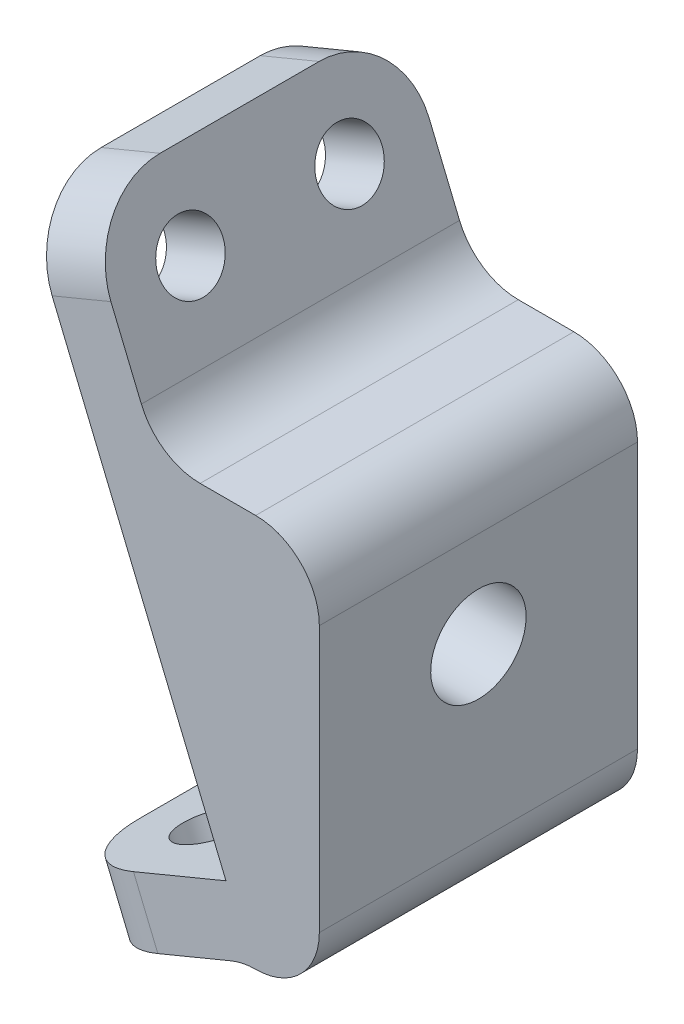
ISO-10303-21;
HEADER;
FILE_DESCRIPTION(('STEP AP214'),'2;1');
FILE_NAME('part.step','',(''),(''),'','','');
FILE_SCHEMA(('AUTOMOTIVE_DESIGN { 1 0 10303 214 1 1 1 1 }'));
ENDSEC;
DATA;
#1=APPLICATION_CONTEXT('core data for automotive mechanical design processes');
#2=APPLICATION_PROTOCOL_DEFINITION('international standard','automotive_design',2000,#1);
#3=PRODUCT_CONTEXT('',#1,'mechanical');
#4=PRODUCT('Part','Part','',(#3));
#5=PRODUCT_RELATED_PRODUCT_CATEGORY('part','',(#4));
#6=PRODUCT_DEFINITION_FORMATION('','',#4);
#7=PRODUCT_DEFINITION_CONTEXT('part definition',#1,'design');
#8=PRODUCT_DEFINITION('design','',#6,#7);
#9=PRODUCT_DEFINITION_SHAPE('','',#8);
#10=(LENGTH_UNIT() NAMED_UNIT(*) SI_UNIT(.MILLI.,.METRE.));
#11=(NAMED_UNIT(*) PLANE_ANGLE_UNIT() SI_UNIT($,.RADIAN.));
#12=(NAMED_UNIT(*) SI_UNIT($,.STERADIAN.) SOLID_ANGLE_UNIT());
#13=UNCERTAINTY_MEASURE_WITH_UNIT(LENGTH_MEASURE(1.E-05),#10,'distance_accuracy_value','');
#14=(GEOMETRIC_REPRESENTATION_CONTEXT(3) GLOBAL_UNCERTAINTY_ASSIGNED_CONTEXT((#13)) GLOBAL_UNIT_ASSIGNED_CONTEXT((#10,
#11,#12)) REPRESENTATION_CONTEXT('',''));
#15=CARTESIAN_POINT('',(0.,0.,0.));
#16=DIRECTION('',(0.,0.,1.));
#17=DIRECTION('',(1.,0.,0.));
#18=AXIS2_PLACEMENT_3D('',#15,#16,#17);
#19=CARTESIAN_POINT('',(24.9233328303467,-24.0423698814154,15.875));
#20=DIRECTION('',(0.923879532511289,0.382683432365084,0.));
#21=DIRECTION('',(-0.382683432365084,0.923879532511289,0.));
#22=AXIS2_PLACEMENT_3D('',#19,#20,#21);
#23=PLANE('',#22);
#24=DIRECTION('',(0.382683432365084,-0.923879532511289,0.));
#25=VECTOR('',#24,1.);
#26=CARTESIAN_POINT('',(3.67887721410562,27.2462829925481,-7.9375));
#27=LINE('',#26,#25);
#28=CARTESIAN_POINT('',(24.9233328303467,-24.0423698814154,-7.9375));
#29=VERTEX_POINT('',#28);
#30=CARTESIAN_POINT('',(27.353372625865,-29.909004912862,-7.9375));
#31=VERTEX_POINT('',#30);
#32=EDGE_CURVE('E456',#29,#31,#27,.T.);
#33=ORIENTED_EDGE('',*,*,#32,.T.);
#34=DIRECTION('',(0.,0.,-1.));
#35=VECTOR('',#34,1.);
#36=CARTESIAN_POINT('',(27.353372625865,-29.909004912862,15.875));
#37=LINE('',#36,#35);
#38=CARTESIAN_POINT('',(27.353372625865,-29.909004912862,7.9375));
#39=VERTEX_POINT('',#38);
#40=EDGE_CURVE('E281',#39,#31,#37,.T.);
#41=ORIENTED_EDGE('',*,*,#40,.F.);
#42=DIRECTION('',(0.382683432365084,-0.923879532511289,0.));
#43=VECTOR('',#42,1.);
#44=CARTESIAN_POINT('',(3.67887721410562,27.2462829925481,7.9375));
#45=LINE('',#44,#43);
#46=CARTESIAN_POINT('',(24.9233328303467,-24.0423698814154,7.9375));
#47=VERTEX_POINT('',#46);
#48=EDGE_CURVE('E57',#47,#39,#45,.T.);
#49=ORIENTED_EDGE('',*,*,#48,.F.);
#50=DIRECTION('',(0.,0.,-1.));
#51=VECTOR('',#50,1.);
#52=CARTESIAN_POINT('',(24.9233328303467,-24.0423698814154,15.875));
#53=LINE('',#52,#51);
#54=EDGE_CURVE('E169',#47,#29,#53,.T.);
#55=ORIENTED_EDGE('',*,*,#54,.T.);
#56=EDGE_LOOP('',(#33,#41,#49,#55));
#57=FACE_BOUND('',#56,.T.);
#58=ADVANCED_FACE('F39',(#57),#23,.F.);
#59=CARTESIAN_POINT('',(21.0980673275658,32.0315079875802,15.875));
#60=DIRECTION('',(0.382683432365084,-0.923879532511289,0.));
#61=DIRECTION('',(0.923879532511289,0.382683432365084,0.));
#62=AXIS2_PLACEMENT_3D('',#59,#60,#61);
#63=PLANE('',#62);
#64=DIRECTION('',(0.,0.,-1.));
#65=VECTOR('',#64,1.);
#66=CARTESIAN_POINT('',(26.9647023590125,34.4615477830985,15.875));
#67=LINE('',#66,#65);
#68=CARTESIAN_POINT('',(26.9647023590125,34.4615477830985,7.9375));
#69=VERTEX_POINT('',#68);
#70=CARTESIAN_POINT('',(26.9647023590125,34.4615477830985,-7.9375));
#71=VERTEX_POINT('',#70);
#72=EDGE_CURVE('E249',#69,#71,#67,.T.);
#73=ORIENTED_EDGE('',*,*,#72,.T.);
#74=DIRECTION('',(0.923879532511289,0.382683432365085,0.));
#75=VECTOR('',#74,1.);
#76=CARTESIAN_POINT('',(-0.801211023471759,22.9605298883971,-7.9375));
#77=LINE('',#76,#75);
#78=CARTESIAN_POINT('',(21.0980673275658,32.0315079875802,-7.9375));
#79=VERTEX_POINT('',#78);
#80=EDGE_CURVE('E318',#79,#71,#77,.T.);
#81=ORIENTED_EDGE('',*,*,#80,.F.);
#82=DIRECTION('',(0.,0.,-1.));
#83=VECTOR('',#82,1.);
#84=CARTESIAN_POINT('',(21.0980673275658,32.0315079875802,15.875));
#85=LINE('',#84,#83);
#86=CARTESIAN_POINT('',(21.0980673275658,32.0315079875802,7.9375));
#87=VERTEX_POINT('',#86);
#88=EDGE_CURVE('E245',#87,#79,#85,.T.);
#89=ORIENTED_EDGE('',*,*,#88,.F.);
#90=DIRECTION('',(0.923879532511289,0.382683432365085,0.));
#91=VECTOR('',#90,1.);
#92=CARTESIAN_POINT('',(-0.801211023471759,22.9605298883971,7.9375));
#93=LINE('',#92,#91);
#94=EDGE_CURVE('E327',#87,#69,#93,.T.);
#95=ORIENTED_EDGE('',*,*,#94,.T.);
#96=EDGE_LOOP('',(#73,#81,#89,#95));
#97=FACE_BOUND('',#96,.T.);
#98=ADVANCED_FACE('F370',(#97),#63,.F.);
#99=CARTESIAN_POINT('',(44.45,-29.700540455513,15.875));
#100=DIRECTION('',(0.,0.,1.));
#101=DIRECTION('',(1.,0.,0.));
#102=AXIS2_PLACEMENT_3D('',#99,#100,#101);
#103=PLANE('',#102);
#104=DIRECTION('',(0.382683432365084,-0.923879532511289,0.));
#105=VECTOR('',#104,1.);
#106=CARTESIAN_POINT('',(11.012171003414,30.2838327369459,15.875));
#107=LINE('',#106,#105);
#108=CARTESIAN_POINT('',(32.2566266196551,-21.0048201370175,15.875));
#109=VERTEX_POINT('',#108);
#110=CARTESIAN_POINT('',(34.6866664151734,-26.8714551684642,15.875));
#111=VERTEX_POINT('',#110);
#112=EDGE_CURVE('E152',#109,#111,#107,.T.);
#113=ORIENTED_EDGE('',*,*,#112,.T.);
#114=DIRECTION('',(0.923879532511289,0.382683432365084,0.));
#115=VECTOR('',#114,1.);
#116=CARTESIAN_POINT('',(27.353372625865,-29.909004912862,15.875));
#117=LINE('',#116,#115);
#118=CARTESIAN_POINT('',(42.0199602044817,-23.8339054240663,15.875));
#119=VERTEX_POINT('',#118);
#120=EDGE_CURVE('E179',#111,#119,#117,.T.);
#121=ORIENTED_EDGE('',*,*,#120,.T.);
#122=CARTESIAN_POINT('',(44.45,-29.700540455513,15.875));
#123=DIRECTION('',(0.,0.,-1.));
#124=DIRECTION('',(1.,0.,0.));
#125=AXIS2_PLACEMENT_3D('',#122,#123,#124);
#126=CIRCLE('',#125,6.35);
#127=CARTESIAN_POINT('',(44.45,-23.350540455513,15.875));
#128=VERTEX_POINT('',#127);
#129=EDGE_CURVE('E184',#119,#128,#126,.T.);
#130=ORIENTED_EDGE('',*,*,#129,.T.);
#131=CARTESIAN_POINT('',(44.45,-17.000540455513,15.875));
#132=DIRECTION('',(0.,0.,1.));
#133=DIRECTION('',(-1.,0.,0.));
#134=AXIS2_PLACEMENT_3D('',#131,#132,#133);
#135=CIRCLE('',#134,6.35);
#136=CARTESIAN_POINT('',(50.8,-17.000540455513,15.875));
#137=VERTEX_POINT('',#136);
#138=EDGE_CURVE('E194',#128,#137,#135,.T.);
#139=ORIENTED_EDGE('',*,*,#138,.T.);
#140=DIRECTION('',(0.,1.,0.));
#141=VECTOR('',#140,1.);
#142=CARTESIAN_POINT('',(50.8,9.52500000000001,15.875));
#143=LINE('',#142,#141);
#144=CARTESIAN_POINT('',(50.8,9.52500000000001,15.875));
#145=VERTEX_POINT('',#144);
#146=EDGE_CURVE('E197',#137,#145,#143,.T.);
#147=ORIENTED_EDGE('',*,*,#146,.T.);
#148=CARTESIAN_POINT('',(44.45,9.52500000000001,15.875));
#149=DIRECTION('',(0.,0.,1.));
#150=DIRECTION('',(1.,0.,0.));
#151=AXIS2_PLACEMENT_3D('',#148,#149,#150);
#152=CIRCLE('',#151,6.35);
#153=CARTESIAN_POINT('',(44.45,15.875,15.875));
#154=VERTEX_POINT('',#153);
#155=EDGE_CURVE('E200',#145,#154,#152,.T.);
#156=ORIENTED_EDGE('',*,*,#155,.T.);
#157=DIRECTION('',(-1.,0.,0.));
#158=VECTOR('',#157,1.);
#159=CARTESIAN_POINT('',(44.45,15.875,15.875));
#160=LINE('',#159,#158);
#161=CARTESIAN_POINT('',(38.9064368792549,15.875,15.875));
#162=VERTEX_POINT('',#161);
#163=EDGE_CURVE('E203',#154,#162,#160,.T.);
#164=ORIENTED_EDGE('',*,*,#163,.T.);
#165=CARTESIAN_POINT('',(38.9064368792549,22.2250000000001,15.875));
#166=DIRECTION('',(0.,0.,-1.));
#167=DIRECTION('',(-1.,0.,0.));
#168=AXIS2_PLACEMENT_3D('',#165,#166,#167);
#169=CIRCLE('',#168,6.35000000000003);
#170=CARTESIAN_POINT('',(33.0398018478082,19.7949602044818,15.875));
#171=VERTEX_POINT('',#170);
#172=EDGE_CURVE('E206',#162,#171,#169,.T.);
#173=ORIENTED_EDGE('',*,*,#172,.T.);
#174=DIRECTION('',(-0.382683432365085,0.923879532511289,0.));
#175=VECTOR('',#174,1.);
#176=CARTESIAN_POINT('',(26.9647023590125,34.4615477830985,15.875));
#177=LINE('',#176,#175);
#178=CARTESIAN_POINT('',(30.0022521034103,27.1282539937901,15.875));
#179=VERTEX_POINT('',#178);
#180=EDGE_CURVE('E209',#171,#179,#177,.T.);
#181=ORIENTED_EDGE('',*,*,#180,.T.);
#182=DIRECTION('',(0.923879532511289,0.382683432365085,0.));
#183=VECTOR('',#182,1.);
#184=CARTESIAN_POINT('',(2.2363387209261,15.6272360990887,15.875));
#185=LINE('',#184,#183);
#186=CARTESIAN_POINT('',(24.1356170719637,24.6982141982718,15.875));
#187=VERTEX_POINT('',#186);
#188=EDGE_CURVE('E290',#179,#187,#185,.F.);
#189=ORIENTED_EDGE('',*,*,#188,.T.);
#190=DIRECTION('',(0.382683432365084,-0.923879532511289,0.));
#191=VECTOR('',#190,1.);
#192=CARTESIAN_POINT('',(21.0980673275658,32.0315079875802,15.875));
#193=LINE('',#192,#191);
#194=CARTESIAN_POINT('',(41.4833741348249,-17.182976179642,15.875));
#195=VERTEX_POINT('',#194);
#196=EDGE_CURVE('E176',#187,#195,#193,.T.);
#197=ORIENTED_EDGE('',*,*,#196,.T.);
#198=DIRECTION('',(-0.923879532511289,-0.382683432365084,0.));
#199=VECTOR('',#198,1.);
#200=CARTESIAN_POINT('',(41.4833741348249,-17.182976179642,15.875));
#201=LINE('',#200,#199);
#202=EDGE_CURVE('E166',#195,#109,#201,.T.);
#203=ORIENTED_EDGE('',*,*,#202,.T.);
#204=EDGE_LOOP('',(#113,#121,#130,#139,#147,#156,#164,#173,#181,#189,#197,#203));
#205=FACE_BOUND('',#204,.T.);
#206=ADVANCED_FACE('F173',(#205),#103,.T.);
#207=CARTESIAN_POINT('',(44.45,-29.700540455513,-15.875));
#208=DIRECTION('',(0.,0.,1.));
#209=DIRECTION('',(1.,0.,0.));
#210=AXIS2_PLACEMENT_3D('',#207,#208,#209);
#211=PLANE('',#210);
#212=DIRECTION('',(0.923879532511289,0.382683432365084,0.));
#213=VECTOR('',#212,1.);
#214=CARTESIAN_POINT('',(27.353372625865,-29.909004912862,-15.875));
#215=LINE('',#214,#213);
#216=CARTESIAN_POINT('',(34.6866664151734,-26.8714551684642,-15.875));
#217=VERTEX_POINT('',#216);
#218=CARTESIAN_POINT('',(42.0199602044817,-23.8339054240663,-15.875));
#219=VERTEX_POINT('',#218);
#220=EDGE_CURVE('E219',#217,#219,#215,.T.);
#221=ORIENTED_EDGE('',*,*,#220,.F.);
#222=DIRECTION('',(0.382683432365084,-0.923879532511289,0.));
#223=VECTOR('',#222,1.);
#224=CARTESIAN_POINT('',(11.012171003414,30.283832736946,-15.875));
#225=LINE('',#224,#223);
#226=CARTESIAN_POINT('',(32.2566266196551,-21.0048201370175,-15.875));
#227=VERTEX_POINT('',#226);
#228=EDGE_CURVE('E65',#227,#217,#225,.T.);
#229=ORIENTED_EDGE('',*,*,#228,.F.);
#230=DIRECTION('',(-0.923879532511289,-0.382683432365084,0.));
#231=VECTOR('',#230,1.);
#232=CARTESIAN_POINT('',(41.4833741348249,-17.182976179642,-15.875));
#233=LINE('',#232,#231);
#234=CARTESIAN_POINT('',(41.4833741348249,-17.182976179642,-15.875));
#235=VERTEX_POINT('',#234);
#236=EDGE_CURVE('E216',#235,#227,#233,.T.);
#237=ORIENTED_EDGE('',*,*,#236,.F.);
#238=DIRECTION('',(0.382683432365084,-0.923879532511289,0.));
#239=VECTOR('',#238,1.);
#240=CARTESIAN_POINT('',(21.0980673275658,32.0315079875802,-15.875));
#241=LINE('',#240,#239);
#242=CARTESIAN_POINT('',(24.1356170719637,24.6982141982718,-15.875));
#243=VERTEX_POINT('',#242);
#244=EDGE_CURVE('E180',#243,#235,#241,.T.);
#245=ORIENTED_EDGE('',*,*,#244,.F.);
#246=DIRECTION('',(0.923879532511289,0.382683432365085,0.));
#247=VECTOR('',#246,1.);
#248=CARTESIAN_POINT('',(2.2363387209261,15.6272360990887,-15.875));
#249=LINE('',#248,#247);
#250=CARTESIAN_POINT('',(30.0022521034103,27.1282539937901,-15.875));
#251=VERTEX_POINT('',#250);
#252=EDGE_CURVE('E287',#251,#243,#249,.F.);
#253=ORIENTED_EDGE('',*,*,#252,.F.);
#254=DIRECTION('',(-0.382683432365085,0.923879532511289,0.));
#255=VECTOR('',#254,1.);
#256=CARTESIAN_POINT('',(26.9647023590125,34.4615477830985,-15.875));
#257=LINE('',#256,#255);
#258=CARTESIAN_POINT('',(33.0398018478082,19.7949602044818,-15.875));
#259=VERTEX_POINT('',#258);
#260=EDGE_CURVE('E186',#259,#251,#257,.T.);
#261=ORIENTED_EDGE('',*,*,#260,.F.);
#262=CARTESIAN_POINT('',(38.9064368792549,22.2250000000001,-15.875));
#263=DIRECTION('',(0.,0.,-1.));
#264=DIRECTION('',(-1.,0.,0.));
#265=AXIS2_PLACEMENT_3D('',#262,#263,#264);
#266=CIRCLE('',#265,6.35000000000003);
#267=CARTESIAN_POINT('',(38.9064368792549,15.875,-15.875));
#268=VERTEX_POINT('',#267);
#269=EDGE_CURVE('E237',#268,#259,#266,.T.);
#270=ORIENTED_EDGE('',*,*,#269,.F.);
#271=DIRECTION('',(-1.,0.,0.));
#272=VECTOR('',#271,1.);
#273=CARTESIAN_POINT('',(44.45,15.875,-15.875));
#274=LINE('',#273,#272);
#275=CARTESIAN_POINT('',(44.45,15.875,-15.875));
#276=VERTEX_POINT('',#275);
#277=EDGE_CURVE('E234',#276,#268,#274,.T.);
#278=ORIENTED_EDGE('',*,*,#277,.F.);
#279=CARTESIAN_POINT('',(44.45,9.52500000000001,-15.875));
#280=DIRECTION('',(0.,0.,1.));
#281=DIRECTION('',(1.,0.,0.));
#282=AXIS2_PLACEMENT_3D('',#279,#280,#281);
#283=CIRCLE('',#282,6.35);
#284=CARTESIAN_POINT('',(50.8,9.52500000000001,-15.875));
#285=VERTEX_POINT('',#284);
#286=EDGE_CURVE('E231',#285,#276,#283,.T.);
#287=ORIENTED_EDGE('',*,*,#286,.F.);
#288=DIRECTION('',(0.,1.,0.));
#289=VECTOR('',#288,1.);
#290=CARTESIAN_POINT('',(50.8,9.52500000000001,-15.875));
#291=LINE('',#290,#289);
#292=CARTESIAN_POINT('',(50.8,-17.000540455513,-15.875));
#293=VERTEX_POINT('',#292);
#294=EDGE_CURVE('E228',#293,#285,#291,.T.);
#295=ORIENTED_EDGE('',*,*,#294,.F.);
#296=CARTESIAN_POINT('',(44.45,-17.000540455513,-15.875));
#297=DIRECTION('',(0.,0.,1.));
#298=DIRECTION('',(-1.,0.,0.));
#299=AXIS2_PLACEMENT_3D('',#296,#297,#298);
#300=CIRCLE('',#299,6.35);
#301=CARTESIAN_POINT('',(44.45,-23.350540455513,-15.875));
#302=VERTEX_POINT('',#301);
#303=EDGE_CURVE('E225',#302,#293,#300,.T.);
#304=ORIENTED_EDGE('',*,*,#303,.F.);
#305=CARTESIAN_POINT('',(44.45,-29.700540455513,-15.875));
#306=DIRECTION('',(0.,0.,-1.));
#307=DIRECTION('',(1.,0.,0.));
#308=AXIS2_PLACEMENT_3D('',#305,#306,#307);
#309=CIRCLE('',#308,6.35);
#310=EDGE_CURVE('E222',#219,#302,#309,.T.);
#311=ORIENTED_EDGE('',*,*,#310,.F.);
#312=EDGE_LOOP('',(#221,#229,#237,#245,#253,#261,#270,#278,#287,#295,#304,#311));
#313=FACE_BOUND('',#312,.T.);
#314=ADVANCED_FACE('F413',(#313),#211,.F.);
#315=CARTESIAN_POINT('',(41.4833741348249,-17.182976179642,15.875));
#316=DIRECTION('',(0.382683432365084,-0.923879532511289,0.));
#317=DIRECTION('',(0.923879532511289,0.382683432365084,0.));
#318=AXIS2_PLACEMENT_3D('',#315,#316,#317);
#319=PLANE('',#318);
#320=CARTESIAN_POINT('',(32.2566266196551,-21.0048201370175,7.9375));
#321=DIRECTION('',(0.382683432365084,-0.923879532511289,0.));
#322=DIRECTION('',(0.923879532511289,0.382683432365084,0.));
#323=AXIS2_PLACEMENT_3D('',#320,#321,#322);
#324=CIRCLE('',#323,3.2385);
#325=CARTESIAN_POINT('',(35.2486104856929,-19.7654998413032,7.9375));
#326=VERTEX_POINT('',#325);
#327=EDGE_CURVE('E311',#326,#326,#324,.T.);
#328=ORIENTED_EDGE('',*,*,#327,.T.);
#329=EDGE_LOOP('',(#328));
#330=FACE_BOUND('',#329,.T.);
#331=CARTESIAN_POINT('',(32.2566266196551,-21.0048201370175,-7.9375));
#332=DIRECTION('',(0.382683432365084,-0.923879532511289,0.));
#333=DIRECTION('',(0.923879532511289,0.382683432365084,0.));
#334=AXIS2_PLACEMENT_3D('',#331,#332,#333);
#335=CIRCLE('',#334,3.23850000000001);
#336=CARTESIAN_POINT('',(35.2486104856929,-19.7654998413032,-7.9375));
#337=VERTEX_POINT('',#336);
#338=EDGE_CURVE('E307',#337,#337,#335,.T.);
#339=ORIENTED_EDGE('',*,*,#338,.T.);
#340=EDGE_LOOP('',(#339));
#341=FACE_BOUND('',#340,.T.);
#342=ORIENTED_EDGE('',*,*,#236,.T.);
#343=CARTESIAN_POINT('',(32.2566266196551,-21.0048201370175,-7.9375));
#344=DIRECTION('',(0.382683432365084,-0.923879532511289,0.));
#345=DIRECTION('',(0.923879532511289,0.382683432365084,0.));
#346=AXIS2_PLACEMENT_3D('',#343,#344,#345);
#347=CIRCLE('',#346,7.9375);
#348=EDGE_CURVE('E312',#227,#29,#347,.F.);
#349=ORIENTED_EDGE('',*,*,#348,.T.);
#350=ORIENTED_EDGE('',*,*,#54,.F.);
#351=CARTESIAN_POINT('',(32.2566266196551,-21.0048201370175,7.9375));
#352=DIRECTION('',(0.382683432365084,-0.923879532511289,0.));
#353=DIRECTION('',(0.923879532511289,0.382683432365084,0.));
#354=AXIS2_PLACEMENT_3D('',#351,#352,#353);
#355=CIRCLE('',#354,7.9375);
#356=EDGE_CURVE('E155',#47,#109,#355,.F.);
#357=ORIENTED_EDGE('',*,*,#356,.T.);
#358=ORIENTED_EDGE('',*,*,#202,.F.);
#359=DIRECTION('',(0.,0.,-1.));
#360=VECTOR('',#359,1.);
#361=CARTESIAN_POINT('',(41.4833741348249,-17.182976179642,15.875));
#362=LINE('',#361,#360);
#363=EDGE_CURVE('E215',#195,#235,#362,.T.);
#364=ORIENTED_EDGE('',*,*,#363,.T.);
#365=EDGE_LOOP('',(#342,#349,#350,#357,#358,#364));
#366=FACE_BOUND('',#365,.T.);
#367=ADVANCED_FACE('F41',(#330,#341,#366),#319,.F.);
#368=CARTESIAN_POINT('',(27.353372625865,-29.909004912862,15.875));
#369=DIRECTION('',(-0.382683432365084,0.923879532511289,0.));
#370=DIRECTION('',(-0.923879532511289,-0.382683432365084,0.));
#371=AXIS2_PLACEMENT_3D('',#368,#369,#370);
#372=PLANE('',#371);
#373=CARTESIAN_POINT('',(34.6866664151734,-26.8714551684642,7.9375));
#374=DIRECTION('',(-0.382683432365084,0.923879532511289,0.));
#375=DIRECTION('',(-0.923879532511289,-0.382683432365084,0.));
#376=AXIS2_PLACEMENT_3D('',#373,#374,#375);
#377=CIRCLE('',#376,3.2385);
#378=CARTESIAN_POINT('',(31.6946825491356,-28.1107754641785,7.9375));
#379=VERTEX_POINT('',#378);
#380=EDGE_CURVE('E308',#379,#379,#377,.T.);
#381=ORIENTED_EDGE('',*,*,#380,.T.);
#382=EDGE_LOOP('',(#381));
#383=FACE_BOUND('',#382,.T.);
#384=CARTESIAN_POINT('',(34.6866664151734,-26.8714551684642,-7.9375));
#385=DIRECTION('',(-0.382683432365084,0.923879532511289,0.));
#386=DIRECTION('',(-0.923879532511289,-0.382683432365084,0.));
#387=AXIS2_PLACEMENT_3D('',#384,#385,#386);
#388=CIRCLE('',#387,3.23850000000001);
#389=CARTESIAN_POINT('',(31.6946825491356,-28.1107754641785,-7.9375));
#390=VERTEX_POINT('',#389);
#391=EDGE_CURVE('E171',#390,#390,#388,.T.);
#392=ORIENTED_EDGE('',*,*,#391,.T.);
#393=EDGE_LOOP('',(#392));
#394=FACE_BOUND('',#393,.T.);
#395=ORIENTED_EDGE('',*,*,#40,.T.);
#396=CARTESIAN_POINT('',(34.6866664151734,-26.8714551684642,-7.9375));
#397=DIRECTION('',(-0.382683432365084,0.923879532511289,0.));
#398=DIRECTION('',(-0.923879532511289,-0.382683432365084,0.));
#399=AXIS2_PLACEMENT_3D('',#396,#397,#398);
#400=CIRCLE('',#399,7.9375);
#401=EDGE_CURVE('E11',#31,#217,#400,.F.);
#402=ORIENTED_EDGE('',*,*,#401,.T.);
#403=ORIENTED_EDGE('',*,*,#220,.T.);
#404=DIRECTION('',(0.,0.,-1.));
#405=VECTOR('',#404,1.);
#406=CARTESIAN_POINT('',(42.0199602044817,-23.8339054240663,15.875));
#407=LINE('',#406,#405);
#408=EDGE_CURVE('E277',#119,#219,#407,.T.);
#409=ORIENTED_EDGE('',*,*,#408,.F.);
#410=ORIENTED_EDGE('',*,*,#120,.F.);
#411=CARTESIAN_POINT('',(34.6866664151734,-26.8714551684642,7.9375));
#412=DIRECTION('',(-0.382683432365084,0.923879532511289,0.));
#413=DIRECTION('',(-0.923879532511289,-0.382683432365084,0.));
#414=AXIS2_PLACEMENT_3D('',#411,#412,#413);
#415=CIRCLE('',#414,7.9375);
#416=EDGE_CURVE('E49',#111,#39,#415,.F.);
#417=ORIENTED_EDGE('',*,*,#416,.T.);
#418=EDGE_LOOP('',(#395,#402,#403,#409,#410,#417));
#419=FACE_BOUND('',#418,.T.);
#420=ADVANCED_FACE('F379',(#383,#394,#419),#372,.F.);
#421=CARTESIAN_POINT('',(44.45,-29.700540455513,15.875));
#422=DIRECTION('',(0.,0.,-1.));
#423=DIRECTION('',(-1.,0.,0.));
#424=AXIS2_PLACEMENT_3D('',#421,#422,#423);
#425=CYLINDRICAL_SURFACE('',#424,6.35);
#426=ORIENTED_EDGE('',*,*,#310,.T.);
#427=DIRECTION('',(0.,0.,-1.));
#428=VECTOR('',#427,1.);
#429=CARTESIAN_POINT('',(44.45,-23.350540455513,15.875));
#430=LINE('',#429,#428);
#431=EDGE_CURVE('E273',#128,#302,#430,.T.);
#432=ORIENTED_EDGE('',*,*,#431,.F.);
#433=ORIENTED_EDGE('',*,*,#129,.F.);
#434=ORIENTED_EDGE('',*,*,#408,.T.);
#435=EDGE_LOOP('',(#426,#432,#433,#434));
#436=FACE_BOUND('',#435,.T.);
#437=ADVANCED_FACE('F382',(#436),#425,.F.);
#438=CARTESIAN_POINT('',(44.45,-17.000540455513,15.875));
#439=DIRECTION('',(0.,0.,-1.));
#440=DIRECTION('',(-1.,0.,0.));
#441=AXIS2_PLACEMENT_3D('',#438,#439,#440);
#442=CYLINDRICAL_SURFACE('',#441,6.35);
#443=ORIENTED_EDGE('',*,*,#303,.T.);
#444=DIRECTION('',(0.,0.,-1.));
#445=VECTOR('',#444,1.);
#446=CARTESIAN_POINT('',(50.8,-17.000540455513,15.875));
#447=LINE('',#446,#445);
#448=EDGE_CURVE('E269',#137,#293,#447,.T.);
#449=ORIENTED_EDGE('',*,*,#448,.F.);
#450=ORIENTED_EDGE('',*,*,#138,.F.);
#451=ORIENTED_EDGE('',*,*,#431,.T.);
#452=EDGE_LOOP('',(#443,#449,#450,#451));
#453=FACE_BOUND('',#452,.T.);
#454=ADVANCED_FACE('F385',(#453),#442,.T.);
#455=CARTESIAN_POINT('',(50.8,9.52500000000001,15.875));
#456=DIRECTION('',(-1.,0.,0.));
#457=DIRECTION('',(0.,-1.,0.));
#458=AXIS2_PLACEMENT_3D('',#455,#456,#457);
#459=PLANE('',#458);
#460=CARTESIAN_POINT('',(50.8,0.,0.));
#461=DIRECTION('',(1.,0.,0.));
#462=DIRECTION('',(0.,1.,0.));
#463=AXIS2_PLACEMENT_3D('',#460,#461,#462);
#464=CIRCLE('',#463,4.7625);
#465=CARTESIAN_POINT('',(50.8,4.76250000000001,0.));
#466=VERTEX_POINT('',#465);
#467=EDGE_CURVE('E463',#466,#466,#464,.T.);
#468=ORIENTED_EDGE('',*,*,#467,.F.);
#469=EDGE_LOOP('',(#468));
#470=FACE_BOUND('',#469,.T.);
#471=ORIENTED_EDGE('',*,*,#294,.T.);
#472=DIRECTION('',(0.,0.,-1.));
#473=VECTOR('',#472,1.);
#474=CARTESIAN_POINT('',(50.8,9.52500000000001,15.875));
#475=LINE('',#474,#473);
#476=EDGE_CURVE('E265',#145,#285,#475,.T.);
#477=ORIENTED_EDGE('',*,*,#476,.F.);
#478=ORIENTED_EDGE('',*,*,#146,.F.);
#479=ORIENTED_EDGE('',*,*,#448,.T.);
#480=EDGE_LOOP('',(#471,#477,#478,#479));
#481=FACE_BOUND('',#480,.T.);
#482=ADVANCED_FACE('F389',(#470,#481),#459,.F.);
#483=CARTESIAN_POINT('',(44.45,9.52500000000001,15.875));
#484=DIRECTION('',(0.,0.,-1.));
#485=DIRECTION('',(-1.,0.,0.));
#486=AXIS2_PLACEMENT_3D('',#483,#484,#485);
#487=CYLINDRICAL_SURFACE('',#486,6.35);
#488=ORIENTED_EDGE('',*,*,#286,.T.);
#489=DIRECTION('',(0.,0.,-1.));
#490=VECTOR('',#489,1.);
#491=CARTESIAN_POINT('',(44.45,15.875,15.875));
#492=LINE('',#491,#490);
#493=EDGE_CURVE('E261',#154,#276,#492,.T.);
#494=ORIENTED_EDGE('',*,*,#493,.F.);
#495=ORIENTED_EDGE('',*,*,#155,.F.);
#496=ORIENTED_EDGE('',*,*,#476,.T.);
#497=EDGE_LOOP('',(#488,#494,#495,#496));
#498=FACE_BOUND('',#497,.T.);
#499=ADVANCED_FACE('F393',(#498),#487,.T.);
#500=CARTESIAN_POINT('',(44.45,15.875,15.875));
#501=DIRECTION('',(0.,-1.,0.));
#502=DIRECTION('',(1.,0.,0.));
#503=AXIS2_PLACEMENT_3D('',#500,#501,#502);
#504=PLANE('',#503);
#505=ORIENTED_EDGE('',*,*,#277,.T.);
#506=DIRECTION('',(0.,0.,-1.));
#507=VECTOR('',#506,1.);
#508=CARTESIAN_POINT('',(38.9064368792549,15.875,15.875));
#509=LINE('',#508,#507);
#510=EDGE_CURVE('E257',#162,#268,#509,.T.);
#511=ORIENTED_EDGE('',*,*,#510,.F.);
#512=ORIENTED_EDGE('',*,*,#163,.F.);
#513=ORIENTED_EDGE('',*,*,#493,.T.);
#514=EDGE_LOOP('',(#505,#511,#512,#513));
#515=FACE_BOUND('',#514,.T.);
#516=ADVANCED_FACE('F397',(#515),#504,.F.);
#517=CARTESIAN_POINT('',(38.9064368792549,22.2250000000001,15.875));
#518=DIRECTION('',(0.,0.,-1.));
#519=DIRECTION('',(-1.,0.,0.));
#520=AXIS2_PLACEMENT_3D('',#517,#518,#519);
#521=CYLINDRICAL_SURFACE('',#520,6.35000000000003);
#522=ORIENTED_EDGE('',*,*,#269,.T.);
#523=DIRECTION('',(0.,0.,-1.));
#524=VECTOR('',#523,1.);
#525=CARTESIAN_POINT('',(33.0398018478082,19.7949602044818,15.875));
#526=LINE('',#525,#524);
#527=EDGE_CURVE('E253',#171,#259,#526,.T.);
#528=ORIENTED_EDGE('',*,*,#527,.F.);
#529=ORIENTED_EDGE('',*,*,#172,.F.);
#530=ORIENTED_EDGE('',*,*,#510,.T.);
#531=EDGE_LOOP('',(#522,#528,#529,#530));
#532=FACE_BOUND('',#531,.T.);
#533=ADVANCED_FACE('F401',(#532),#521,.F.);
#534=CARTESIAN_POINT('',(26.9647023590125,34.4615477830985,15.875));
#535=DIRECTION('',(-0.923879532511289,-0.382683432365085,0.));
#536=DIRECTION('',(0.382683432365085,-0.923879532511289,0.));
#537=AXIS2_PLACEMENT_3D('',#534,#535,#536);
#538=PLANE('',#537);
#539=CARTESIAN_POINT('',(30.0022521034103,27.1282539937901,7.9375));
#540=DIRECTION('',(-0.923879532511289,-0.382683432365085,0.));
#541=DIRECTION('',(0.382683432365085,-0.923879532511289,0.));
#542=AXIS2_PLACEMENT_3D('',#539,#540,#541);
#543=CIRCLE('',#542,3.2385);
#544=CARTESIAN_POINT('',(31.2415723991247,24.1362701277523,7.9375));
#545=VERTEX_POINT('',#544);
#546=EDGE_CURVE('E189',#545,#545,#543,.T.);
#547=ORIENTED_EDGE('',*,*,#546,.T.);
#548=EDGE_LOOP('',(#547));
#549=FACE_BOUND('',#548,.T.);
#550=CARTESIAN_POINT('',(30.0022521034103,27.1282539937901,-7.9375));
#551=DIRECTION('',(-0.923879532511289,-0.382683432365085,0.));
#552=DIRECTION('',(0.382683432365085,-0.923879532511289,0.));
#553=AXIS2_PLACEMENT_3D('',#550,#551,#552);
#554=CIRCLE('',#553,3.2385);
#555=CARTESIAN_POINT('',(31.2415723991247,24.1362701277523,-7.9375));
#556=VERTEX_POINT('',#555);
#557=EDGE_CURVE('E297',#556,#556,#554,.T.);
#558=ORIENTED_EDGE('',*,*,#557,.T.);
#559=EDGE_LOOP('',(#558));
#560=FACE_BOUND('',#559,.T.);
#561=ORIENTED_EDGE('',*,*,#260,.T.);
#562=CARTESIAN_POINT('',(30.0022521034103,27.1282539937901,-7.9375));
#563=DIRECTION('',(-0.923879532511289,-0.382683432365085,0.));
#564=DIRECTION('',(0.382683432365085,-0.923879532511289,0.));
#565=AXIS2_PLACEMENT_3D('',#562,#563,#564);
#566=CIRCLE('',#565,7.93749999999999);
#567=EDGE_CURVE('E335',#251,#71,#566,.F.);
#568=ORIENTED_EDGE('',*,*,#567,.T.);
#569=ORIENTED_EDGE('',*,*,#72,.F.);
#570=CARTESIAN_POINT('',(30.0022521034103,27.1282539937901,7.9375));
#571=DIRECTION('',(-0.923879532511289,-0.382683432365085,0.));
#572=DIRECTION('',(0.382683432365085,-0.923879532511289,0.));
#573=AXIS2_PLACEMENT_3D('',#570,#571,#572);
#574=CIRCLE('',#573,7.9375);
#575=EDGE_CURVE('E298',#69,#179,#574,.F.);
#576=ORIENTED_EDGE('',*,*,#575,.T.);
#577=ORIENTED_EDGE('',*,*,#180,.F.);
#578=ORIENTED_EDGE('',*,*,#527,.T.);
#579=EDGE_LOOP('',(#561,#568,#569,#576,#577,#578));
#580=FACE_BOUND('',#579,.T.);
#581=ADVANCED_FACE('F349',(#549,#560,#580),#538,.F.);
#582=CARTESIAN_POINT('',(21.0980673275658,32.0315079875802,15.875));
#583=DIRECTION('',(0.923879532511289,0.382683432365085,0.));
#584=DIRECTION('',(-0.382683432365085,0.923879532511289,0.));
#585=AXIS2_PLACEMENT_3D('',#582,#583,#584);
#586=PLANE('',#585);
#587=CARTESIAN_POINT('',(34.3659523592834,0.,0.));
#588=DIRECTION('',(0.923879532511289,0.382683432365085,0.));
#589=DIRECTION('',(0.382683432365085,-0.923879532511289,0.));
#590=AXIS2_PLACEMENT_3D('',#587,#588,#589);
#591=ELLIPSE('',#590,5.15489285389251,4.7625);
#592=CARTESIAN_POINT('',(36.3386444500853,-4.76249999999999,0.));
#593=VERTEX_POINT('',#592);
#594=EDGE_CURVE('E43',#593,#593,#591,.T.);
#595=ORIENTED_EDGE('',*,*,#594,.T.);
#596=EDGE_LOOP('',(#595));
#597=FACE_BOUND('',#596,.T.);
#598=CARTESIAN_POINT('',(24.1356170719637,24.6982141982718,7.9375));
#599=DIRECTION('',(0.923879532511289,0.382683432365085,0.));
#600=DIRECTION('',(-0.382683432365085,0.923879532511289,0.));
#601=AXIS2_PLACEMENT_3D('',#598,#599,#600);
#602=CIRCLE('',#601,3.2385);
#603=CARTESIAN_POINT('',(22.8962967762493,27.6901980643097,7.9375));
#604=VERTEX_POINT('',#603);
#605=EDGE_CURVE('E299',#604,#604,#602,.T.);
#606=ORIENTED_EDGE('',*,*,#605,.T.);
#607=EDGE_LOOP('',(#606));
#608=FACE_BOUND('',#607,.T.);
#609=CARTESIAN_POINT('',(24.1356170719637,24.6982141982718,-7.9375));
#610=DIRECTION('',(0.923879532511289,0.382683432365085,0.));
#611=DIRECTION('',(-0.382683432365085,0.923879532511289,0.));
#612=AXIS2_PLACEMENT_3D('',#609,#610,#611);
#613=CIRCLE('',#612,3.2385);
#614=CARTESIAN_POINT('',(22.8962967762493,27.6901980643097,-7.9375));
#615=VERTEX_POINT('',#614);
#616=EDGE_CURVE('E293',#615,#615,#613,.T.);
#617=ORIENTED_EDGE('',*,*,#616,.T.);
#618=EDGE_LOOP('',(#617));
#619=FACE_BOUND('',#618,.T.);
#620=ORIENTED_EDGE('',*,*,#88,.T.);
#621=CARTESIAN_POINT('',(24.1356170719637,24.6982141982718,-7.9375));
#622=DIRECTION('',(0.923879532511289,0.382683432365085,0.));
#623=DIRECTION('',(-0.382683432365085,0.923879532511289,0.));
#624=AXIS2_PLACEMENT_3D('',#621,#622,#623);
#625=CIRCLE('',#624,7.93749999999999);
#626=EDGE_CURVE('E331',#79,#243,#625,.F.);
#627=ORIENTED_EDGE('',*,*,#626,.T.);
#628=ORIENTED_EDGE('',*,*,#244,.T.);
#629=ORIENTED_EDGE('',*,*,#363,.F.);
#630=ORIENTED_EDGE('',*,*,#196,.F.);
#631=CARTESIAN_POINT('',(24.1356170719637,24.6982141982718,7.9375));
#632=DIRECTION('',(0.923879532511289,0.382683432365085,0.));
#633=DIRECTION('',(-0.382683432365085,0.923879532511289,0.));
#634=AXIS2_PLACEMENT_3D('',#631,#632,#633);
#635=CIRCLE('',#634,7.9375);
#636=EDGE_CURVE('E339',#187,#87,#635,.F.);
#637=ORIENTED_EDGE('',*,*,#636,.T.);
#638=EDGE_LOOP('',(#620,#627,#628,#629,#630,#637));
#639=FACE_BOUND('',#638,.T.);
#640=ADVANCED_FACE('F407',(#597,#608,#619,#639),#586,.F.);
#641=CARTESIAN_POINT('',(2.2363387209261,15.6272360990887,-7.9375));
#642=DIRECTION('',(0.923879532511289,0.382683432365085,0.));
#643=DIRECTION('',(-0.382683432365085,0.923879532511289,0.));
#644=AXIS2_PLACEMENT_3D('',#641,#642,#643);
#645=CYLINDRICAL_SURFACE('',#644,7.93749999999999);
#646=ORIENTED_EDGE('',*,*,#252,.T.);
#647=ORIENTED_EDGE('',*,*,#626,.F.);
#648=ORIENTED_EDGE('',*,*,#80,.T.);
#649=ORIENTED_EDGE('',*,*,#567,.F.);
#650=EDGE_LOOP('',(#646,#647,#648,#649));
#651=FACE_BOUND('',#650,.T.);
#652=ADVANCED_FACE('F364',(#651),#645,.T.);
#653=CARTESIAN_POINT('',(2.2363387209261,15.6272360990887,7.9375));
#654=DIRECTION('',(0.923879532511289,0.382683432365085,0.));
#655=DIRECTION('',(-0.382683432365085,0.923879532511289,0.));
#656=AXIS2_PLACEMENT_3D('',#653,#654,#655);
#657=CYLINDRICAL_SURFACE('',#656,7.9375);
#658=ORIENTED_EDGE('',*,*,#94,.F.);
#659=ORIENTED_EDGE('',*,*,#636,.F.);
#660=ORIENTED_EDGE('',*,*,#188,.F.);
#661=ORIENTED_EDGE('',*,*,#575,.F.);
#662=EDGE_LOOP('',(#658,#659,#660,#661));
#663=FACE_BOUND('',#662,.T.);
#664=ADVANCED_FACE('F355',(#663),#657,.T.);
#665=CARTESIAN_POINT('',(2.2363387209261,15.6272360990887,-7.9375));
#666=DIRECTION('',(0.923879532511289,0.382683432365085,0.));
#667=DIRECTION('',(-0.382683432365085,0.923879532511289,0.));
#668=AXIS2_PLACEMENT_3D('',#665,#666,#667);
#669=CYLINDRICAL_SURFACE('',#668,3.2385);
#670=ORIENTED_EDGE('',*,*,#616,.F.);
#671=EDGE_LOOP('',(#670));
#672=FACE_BOUND('',#671,.T.);
#673=ORIENTED_EDGE('',*,*,#557,.F.);
#674=EDGE_LOOP('',(#673));
#675=FACE_BOUND('',#674,.T.);
#676=ADVANCED_FACE('F352',(#672,#675),#669,.F.);
#677=CARTESIAN_POINT('',(2.2363387209261,15.6272360990887,7.9375));
#678=DIRECTION('',(0.923879532511289,0.382683432365085,0.));
#679=DIRECTION('',(-0.382683432365085,0.923879532511289,0.));
#680=AXIS2_PLACEMENT_3D('',#677,#678,#679);
#681=CYLINDRICAL_SURFACE('',#680,3.2385);
#682=ORIENTED_EDGE('',*,*,#605,.F.);
#683=EDGE_LOOP('',(#682));
#684=FACE_BOUND('',#683,.T.);
#685=ORIENTED_EDGE('',*,*,#546,.F.);
#686=EDGE_LOOP('',(#685));
#687=FACE_BOUND('',#686,.T.);
#688=ADVANCED_FACE('F354',(#684,#687),#681,.F.);
#689=CARTESIAN_POINT('',(11.012171003414,30.2838327369459,7.9375));
#690=DIRECTION('',(0.382683432365084,-0.923879532511289,0.));
#691=DIRECTION('',(0.923879532511289,0.382683432365084,0.));
#692=AXIS2_PLACEMENT_3D('',#689,#690,#691);
#693=CYLINDRICAL_SURFACE('',#692,7.9375);
#694=ORIENTED_EDGE('',*,*,#48,.T.);
#695=ORIENTED_EDGE('',*,*,#416,.F.);
#696=ORIENTED_EDGE('',*,*,#112,.F.);
#697=ORIENTED_EDGE('',*,*,#356,.F.);
#698=EDGE_LOOP('',(#694,#695,#696,#697));
#699=FACE_BOUND('',#698,.T.);
#700=ADVANCED_FACE('F154',(#699),#693,.T.);
#701=CARTESIAN_POINT('',(11.012171003414,30.283832736946,-7.9375));
#702=DIRECTION('',(0.382683432365084,-0.923879532511289,0.));
#703=DIRECTION('',(0.923879532511289,0.382683432365084,0.));
#704=AXIS2_PLACEMENT_3D('',#701,#702,#703);
#705=CYLINDRICAL_SURFACE('',#704,3.23850000000001);
#706=ORIENTED_EDGE('',*,*,#391,.F.);
#707=EDGE_LOOP('',(#706));
#708=FACE_BOUND('',#707,.T.);
#709=ORIENTED_EDGE('',*,*,#338,.F.);
#710=EDGE_LOOP('',(#709));
#711=FACE_BOUND('',#710,.T.);
#712=ADVANCED_FACE('F490',(#708,#711),#705,.F.);
#713=CARTESIAN_POINT('',(11.012171003414,30.283832736946,-7.9375));
#714=DIRECTION('',(0.382683432365084,-0.923879532511289,0.));
#715=DIRECTION('',(0.923879532511289,0.382683432365084,0.));
#716=AXIS2_PLACEMENT_3D('',#713,#714,#715);
#717=CYLINDRICAL_SURFACE('',#716,7.9375);
#718=ORIENTED_EDGE('',*,*,#228,.T.);
#719=ORIENTED_EDGE('',*,*,#401,.F.);
#720=ORIENTED_EDGE('',*,*,#32,.F.);
#721=ORIENTED_EDGE('',*,*,#348,.F.);
#722=EDGE_LOOP('',(#718,#719,#720,#721));
#723=FACE_BOUND('',#722,.T.);
#724=ADVANCED_FACE('F455',(#723),#717,.T.);
#725=CARTESIAN_POINT('',(11.012171003414,30.2838327369459,7.9375));
#726=DIRECTION('',(0.382683432365084,-0.923879532511289,0.));
#727=DIRECTION('',(0.923879532511289,0.382683432365084,0.));
#728=AXIS2_PLACEMENT_3D('',#725,#726,#727);
#729=CYLINDRICAL_SURFACE('',#728,3.2385);
#730=ORIENTED_EDGE('',*,*,#380,.F.);
#731=EDGE_LOOP('',(#730));
#732=FACE_BOUND('',#731,.T.);
#733=ORIENTED_EDGE('',*,*,#327,.F.);
#734=EDGE_LOOP('',(#733));
#735=FACE_BOUND('',#734,.T.);
#736=ADVANCED_FACE('F474',(#732,#735),#729,.F.);
#737=CARTESIAN_POINT('',(21.0980673275658,0.,0.));
#738=DIRECTION('',(1.,0.,0.));
#739=DIRECTION('',(0.,1.,0.));
#740=AXIS2_PLACEMENT_3D('',#737,#738,#739);
#741=CYLINDRICAL_SURFACE('',#740,4.7625);
#742=ORIENTED_EDGE('',*,*,#467,.T.);
#743=EDGE_LOOP('',(#742));
#744=FACE_BOUND('',#743,.T.);
#745=ORIENTED_EDGE('',*,*,#594,.F.);
#746=EDGE_LOOP('',(#745));
#747=FACE_BOUND('',#746,.T.);
#748=ADVANCED_FACE('F471',(#744,#747),#741,.F.);
#749=CLOSED_SHELL('',(#58,#98,#206,#314,#367,#420,#437,#454,#482,#499,#516,#533,#581,#640,#652,
#664,#676,#688,#700,#712,#724,#736,#748));
#750=MANIFOLD_SOLID_BREP('B2',#749);
#751=ADVANCED_BREP_SHAPE_REPRESENTATION('',(#18,#750),#14);
#752=SHAPE_DEFINITION_REPRESENTATION(#9,#751);
ENDSEC;
END-ISO-10303-21;
